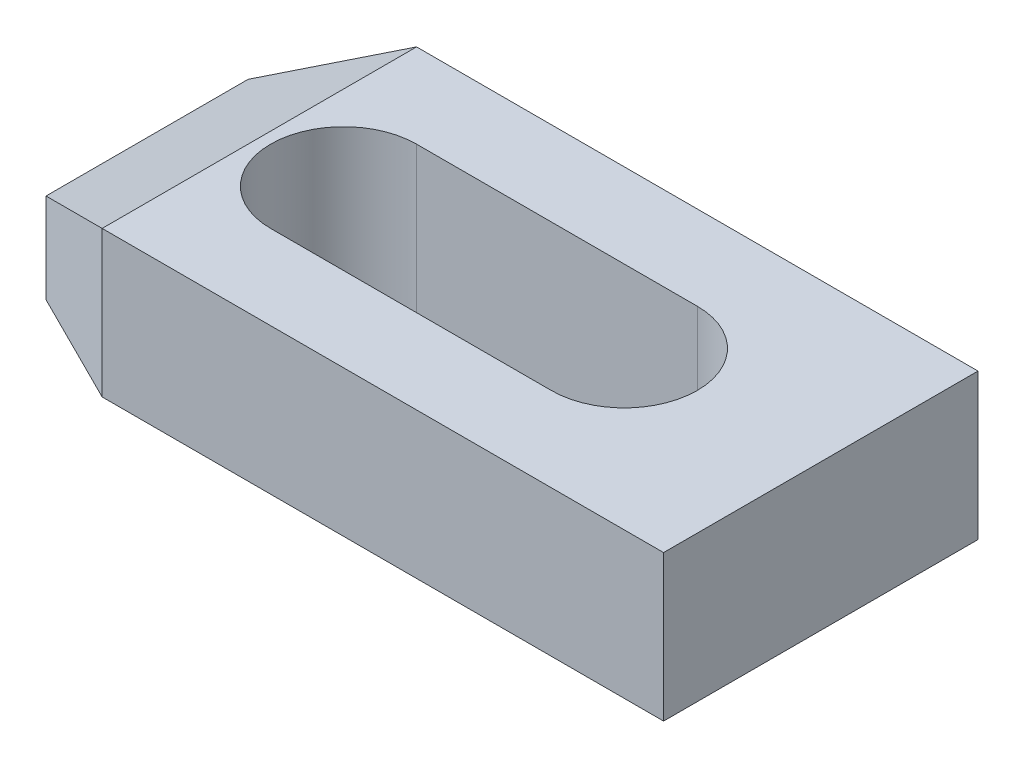
ISO-10303-21;
HEADER;
FILE_DESCRIPTION(('STEP AP214'),'2;1');
FILE_NAME('part.step','',(''),(''),'','','');
FILE_SCHEMA(('AUTOMOTIVE_DESIGN { 1 0 10303 214 1 1 1 1 }'));
ENDSEC;
DATA;
#1=APPLICATION_CONTEXT('core data for automotive mechanical design processes');
#2=APPLICATION_PROTOCOL_DEFINITION('international standard','automotive_design',2000,#1);
#3=PRODUCT_CONTEXT('',#1,'mechanical');
#4=PRODUCT('Part','Part','',(#3));
#5=PRODUCT_RELATED_PRODUCT_CATEGORY('part','',(#4));
#6=PRODUCT_DEFINITION_FORMATION('','',#4);
#7=PRODUCT_DEFINITION_CONTEXT('part definition',#1,'design');
#8=PRODUCT_DEFINITION('design','',#6,#7);
#9=PRODUCT_DEFINITION_SHAPE('','',#8);
#10=(LENGTH_UNIT() NAMED_UNIT(*) SI_UNIT(.MILLI.,.METRE.));
#11=(NAMED_UNIT(*) PLANE_ANGLE_UNIT() SI_UNIT($,.RADIAN.));
#12=(NAMED_UNIT(*) SI_UNIT($,.STERADIAN.) SOLID_ANGLE_UNIT());
#13=UNCERTAINTY_MEASURE_WITH_UNIT(LENGTH_MEASURE(1.E-05),#10,'distance_accuracy_value','');
#14=(GEOMETRIC_REPRESENTATION_CONTEXT(3) GLOBAL_UNCERTAINTY_ASSIGNED_CONTEXT((#13)) GLOBAL_UNIT_ASSIGNED_CONTEXT((#10,
#11,#12)) REPRESENTATION_CONTEXT('',''));
#15=CARTESIAN_POINT('',(0.,0.,0.));
#16=DIRECTION('',(0.,0.,1.));
#17=DIRECTION('',(1.,0.,0.));
#18=AXIS2_PLACEMENT_3D('',#15,#16,#17);
#19=CARTESIAN_POINT('',(0.,13.,0.));
#20=DIRECTION('',(0.,-1.,0.));
#21=DIRECTION('',(0.,0.,-1.));
#22=AXIS2_PLACEMENT_3D('',#19,#20,#21);
#23=PLANE('',#22);
#24=DIRECTION('',(-1.,0.,0.));
#25=VECTOR('',#24,1.);
#26=CARTESIAN_POINT('',(-20.,13.,-14.));
#27=LINE('',#26,#25);
#28=CARTESIAN_POINT('',(30.,13.,-14.));
#29=VERTEX_POINT('',#28);
#30=CARTESIAN_POINT('',(-20.,13.,-14.));
#31=VERTEX_POINT('',#30);
#32=EDGE_CURVE('E135',#29,#31,#27,.T.);
#33=ORIENTED_EDGE('',*,*,#32,.T.);
#34=DIRECTION('',(0.,0.,1.));
#35=VECTOR('',#34,1.);
#36=CARTESIAN_POINT('',(-20.,13.,-14.));
#37=LINE('',#36,#35);
#38=CARTESIAN_POINT('',(-20.,13.,14.));
#39=VERTEX_POINT('',#38);
#40=EDGE_CURVE('E115',#31,#39,#37,.T.);
#41=ORIENTED_EDGE('',*,*,#40,.T.);
#42=DIRECTION('',(1.,0.,0.));
#43=VECTOR('',#42,1.);
#44=CARTESIAN_POINT('',(-20.,13.,14.));
#45=LINE('',#44,#43);
#46=CARTESIAN_POINT('',(30.,13.,14.));
#47=VERTEX_POINT('',#46);
#48=EDGE_CURVE('E142',#39,#47,#45,.T.);
#49=ORIENTED_EDGE('',*,*,#48,.T.);
#50=DIRECTION('',(0.,0.,-1.));
#51=VECTOR('',#50,1.);
#52=CARTESIAN_POINT('',(30.,13.,14.));
#53=LINE('',#52,#51);
#54=EDGE_CURVE('E138',#47,#29,#53,.T.);
#55=ORIENTED_EDGE('',*,*,#54,.T.);
#56=EDGE_LOOP('',(#33,#41,#49,#55));
#57=FACE_BOUND('',#56,.T.);
#58=CARTESIAN_POINT('',(-12.5,13.,0.));
#59=DIRECTION('',(0.,1.,0.));
#60=DIRECTION('',(0.,0.,1.));
#61=AXIS2_PLACEMENT_3D('',#58,#59,#60);
#62=CIRCLE('',#61,6.5);
#63=CARTESIAN_POINT('',(-12.5,13.,-6.5));
#64=VERTEX_POINT('',#63);
#65=CARTESIAN_POINT('',(-12.5,13.,6.5));
#66=VERTEX_POINT('',#65);
#67=EDGE_CURVE('E185',#64,#66,#62,.T.);
#68=ORIENTED_EDGE('',*,*,#67,.F.);
#69=DIRECTION('',(-1.,0.,0.));
#70=VECTOR('',#69,1.);
#71=CARTESIAN_POINT('',(-12.5,13.,-6.5));
#72=LINE('',#71,#70);
#73=CARTESIAN_POINT('',(12.5,13.,-6.5));
#74=VERTEX_POINT('',#73);
#75=EDGE_CURVE('E181',#74,#64,#72,.T.);
#76=ORIENTED_EDGE('',*,*,#75,.F.);
#77=CARTESIAN_POINT('',(12.5,13.,0.));
#78=DIRECTION('',(0.,1.,0.));
#79=DIRECTION('',(0.,0.,1.));
#80=AXIS2_PLACEMENT_3D('',#77,#78,#79);
#81=CIRCLE('',#80,6.5);
#82=CARTESIAN_POINT('',(12.5,13.,6.49999999999999));
#83=VERTEX_POINT('',#82);
#84=EDGE_CURVE('E195',#83,#74,#81,.T.);
#85=ORIENTED_EDGE('',*,*,#84,.F.);
#86=DIRECTION('',(1.,0.,0.));
#87=VECTOR('',#86,1.);
#88=CARTESIAN_POINT('',(-12.5,13.,6.5));
#89=LINE('',#88,#87);
#90=EDGE_CURVE('E197',#66,#83,#89,.T.);
#91=ORIENTED_EDGE('',*,*,#90,.F.);
#92=EDGE_LOOP('',(#68,#76,#85,#91));
#93=FACE_BOUND('',#92,.T.);
#94=ADVANCED_FACE('F41',(#57,#93),#23,.F.);
#95=CARTESIAN_POINT('',(0.,0.,0.));
#96=DIRECTION('',(0.,-1.,0.));
#97=DIRECTION('',(0.,0.,-1.));
#98=AXIS2_PLACEMENT_3D('',#95,#96,#97);
#99=PLANE('',#98);
#100=DIRECTION('',(0.,0.,-1.));
#101=VECTOR('',#100,1.);
#102=CARTESIAN_POINT('',(30.,0.,14.));
#103=LINE('',#102,#101);
#104=CARTESIAN_POINT('',(30.,0.,14.));
#105=VERTEX_POINT('',#104);
#106=CARTESIAN_POINT('',(30.,0.,-14.));
#107=VERTEX_POINT('',#106);
#108=EDGE_CURVE('E167',#105,#107,#103,.T.);
#109=ORIENTED_EDGE('',*,*,#108,.F.);
#110=DIRECTION('',(1.,0.,0.));
#111=VECTOR('',#110,1.);
#112=CARTESIAN_POINT('',(-20.,0.,14.));
#113=LINE('',#112,#111);
#114=CARTESIAN_POINT('',(-20.,0.,14.));
#115=VERTEX_POINT('',#114);
#116=EDGE_CURVE('E157',#115,#105,#113,.T.);
#117=ORIENTED_EDGE('',*,*,#116,.F.);
#118=DIRECTION('',(0.894427190999916,0.,0.447213595499958));
#119=VECTOR('',#118,1.);
#120=CARTESIAN_POINT('',(-20.,0.,14.));
#121=LINE('',#120,#119);
#122=CARTESIAN_POINT('',(-30.,0.,9.));
#123=VERTEX_POINT('',#122);
#124=EDGE_CURVE('E159',#123,#115,#121,.T.);
#125=ORIENTED_EDGE('',*,*,#124,.F.);
#126=DIRECTION('',(0.,0.,1.));
#127=VECTOR('',#126,1.);
#128=CARTESIAN_POINT('',(-30.,0.,9.));
#129=LINE('',#128,#127);
#130=CARTESIAN_POINT('',(-30.,0.,-9.));
#131=VERTEX_POINT('',#130);
#132=EDGE_CURVE('E161',#131,#123,#129,.T.);
#133=ORIENTED_EDGE('',*,*,#132,.F.);
#134=DIRECTION('',(-0.894427190999916,0.,0.447213595499958));
#135=VECTOR('',#134,1.);
#136=CARTESIAN_POINT('',(-20.,0.,-14.));
#137=LINE('',#136,#135);
#138=CARTESIAN_POINT('',(-20.,0.,-14.));
#139=VERTEX_POINT('',#138);
#140=EDGE_CURVE('E164',#139,#131,#137,.T.);
#141=ORIENTED_EDGE('',*,*,#140,.F.);
#142=DIRECTION('',(-1.,0.,0.));
#143=VECTOR('',#142,1.);
#144=CARTESIAN_POINT('',(-20.,0.,-14.));
#145=LINE('',#144,#143);
#146=EDGE_CURVE('E145',#107,#139,#145,.T.);
#147=ORIENTED_EDGE('',*,*,#146,.F.);
#148=EDGE_LOOP('',(#109,#117,#125,#133,#141,#147));
#149=FACE_BOUND('',#148,.T.);
#150=DIRECTION('',(-1.,0.,0.));
#151=VECTOR('',#150,1.);
#152=CARTESIAN_POINT('',(-12.5,0.,-6.5));
#153=LINE('',#152,#151);
#154=CARTESIAN_POINT('',(12.5,0.,-6.5));
#155=VERTEX_POINT('',#154);
#156=CARTESIAN_POINT('',(-12.5,0.,-6.5));
#157=VERTEX_POINT('',#156);
#158=EDGE_CURVE('E182',#155,#157,#153,.T.);
#159=ORIENTED_EDGE('',*,*,#158,.T.);
#160=CARTESIAN_POINT('',(-12.5,0.,0.));
#161=DIRECTION('',(0.,1.,0.));
#162=DIRECTION('',(0.,0.,1.));
#163=AXIS2_PLACEMENT_3D('',#160,#161,#162);
#164=CIRCLE('',#163,6.5);
#165=CARTESIAN_POINT('',(-12.5,0.,6.5));
#166=VERTEX_POINT('',#165);
#167=EDGE_CURVE('E132',#157,#166,#164,.T.);
#168=ORIENTED_EDGE('',*,*,#167,.T.);
#169=DIRECTION('',(1.,0.,0.));
#170=VECTOR('',#169,1.);
#171=CARTESIAN_POINT('',(-12.5,0.,6.5));
#172=LINE('',#171,#170);
#173=CARTESIAN_POINT('',(12.5,0.,6.49999999999999));
#174=VERTEX_POINT('',#173);
#175=EDGE_CURVE('E189',#166,#174,#172,.T.);
#176=ORIENTED_EDGE('',*,*,#175,.T.);
#177=CARTESIAN_POINT('',(12.5,0.,0.));
#178=DIRECTION('',(0.,1.,0.));
#179=DIRECTION('',(0.,0.,1.));
#180=AXIS2_PLACEMENT_3D('',#177,#178,#179);
#181=CIRCLE('',#180,6.5);
#182=EDGE_CURVE('E186',#174,#155,#181,.T.);
#183=ORIENTED_EDGE('',*,*,#182,.T.);
#184=EDGE_LOOP('',(#159,#168,#176,#183));
#185=FACE_BOUND('',#184,.T.);
#186=ADVANCED_FACE('F215',(#149,#185),#99,.T.);
#187=CARTESIAN_POINT('',(30.,13.,14.));
#188=DIRECTION('',(-1.,0.,0.));
#189=DIRECTION('',(0.,0.,1.));
#190=AXIS2_PLACEMENT_3D('',#187,#188,#189);
#191=PLANE('',#190);
#192=ORIENTED_EDGE('',*,*,#108,.T.);
#193=DIRECTION('',(0.,-1.,0.));
#194=VECTOR('',#193,1.);
#195=CARTESIAN_POINT('',(30.,13.,-14.));
#196=LINE('',#195,#194);
#197=EDGE_CURVE('E49',#29,#107,#196,.T.);
#198=ORIENTED_EDGE('',*,*,#197,.F.);
#199=ORIENTED_EDGE('',*,*,#54,.F.);
#200=DIRECTION('',(0.,-1.,0.));
#201=VECTOR('',#200,1.);
#202=CARTESIAN_POINT('',(30.,13.,14.));
#203=LINE('',#202,#201);
#204=EDGE_CURVE('E154',#47,#105,#203,.T.);
#205=ORIENTED_EDGE('',*,*,#204,.T.);
#206=EDGE_LOOP('',(#192,#198,#199,#205));
#207=FACE_BOUND('',#206,.T.);
#208=ADVANCED_FACE('F43',(#207),#191,.F.);
#209=CARTESIAN_POINT('',(-20.,13.,-14.));
#210=DIRECTION('',(0.,0.,1.));
#211=DIRECTION('',(1.,0.,0.));
#212=AXIS2_PLACEMENT_3D('',#209,#210,#211);
#213=PLANE('',#212);
#214=ORIENTED_EDGE('',*,*,#146,.T.);
#215=DIRECTION('',(0.,-1.,0.));
#216=VECTOR('',#215,1.);
#217=CARTESIAN_POINT('',(-20.,13.,-14.));
#218=LINE('',#217,#216);
#219=EDGE_CURVE('E129',#31,#139,#218,.T.);
#220=ORIENTED_EDGE('',*,*,#219,.F.);
#221=ORIENTED_EDGE('',*,*,#32,.F.);
#222=ORIENTED_EDGE('',*,*,#197,.T.);
#223=EDGE_LOOP('',(#214,#220,#221,#222));
#224=FACE_BOUND('',#223,.T.);
#225=ADVANCED_FACE('F144',(#224),#213,.F.);
#226=CARTESIAN_POINT('',(-20.,13.,-14.));
#227=DIRECTION('',(0.447213595499958,0.,0.894427190999916));
#228=DIRECTION('',(0.894427190999916,0.,-0.447213595499958));
#229=AXIS2_PLACEMENT_3D('',#226,#227,#228);
#230=PLANE('',#229);
#231=DIRECTION('',(0.,-1.,0.));
#232=VECTOR('',#231,1.);
#233=CARTESIAN_POINT('',(-30.,13.,-9.));
#234=LINE('',#233,#232);
#235=CARTESIAN_POINT('',(-30.,8.,-9.));
#236=VERTEX_POINT('',#235);
#237=EDGE_CURVE('E131',#236,#131,#234,.T.);
#238=ORIENTED_EDGE('',*,*,#237,.F.);
#239=DIRECTION('',(0.816496580927726,0.408248290463863,-0.408248290463863));
#240=VECTOR('',#239,1.);
#241=CARTESIAN_POINT('',(-20.,13.,-14.));
#242=LINE('',#241,#240);
#243=EDGE_CURVE('E118',#236,#31,#242,.T.);
#244=ORIENTED_EDGE('',*,*,#243,.T.);
#245=ORIENTED_EDGE('',*,*,#219,.T.);
#246=ORIENTED_EDGE('',*,*,#140,.T.);
#247=EDGE_LOOP('',(#238,#244,#245,#246));
#248=FACE_BOUND('',#247,.T.);
#249=ADVANCED_FACE('F126',(#248),#230,.F.);
#250=CARTESIAN_POINT('',(-30.,13.,9.));
#251=DIRECTION('',(1.,0.,0.));
#252=DIRECTION('',(0.,0.,-1.));
#253=AXIS2_PLACEMENT_3D('',#250,#251,#252);
#254=PLANE('',#253);
#255=DIRECTION('',(0.,-1.,0.));
#256=VECTOR('',#255,1.);
#257=CARTESIAN_POINT('',(-30.,13.,9.));
#258=LINE('',#257,#256);
#259=CARTESIAN_POINT('',(-30.,8.,9.));
#260=VERTEX_POINT('',#259);
#261=EDGE_CURVE('E147',#260,#123,#258,.T.);
#262=ORIENTED_EDGE('',*,*,#261,.F.);
#263=DIRECTION('',(0.,0.,1.));
#264=VECTOR('',#263,1.);
#265=CARTESIAN_POINT('',(-30.,8.,-14.));
#266=LINE('',#265,#264);
#267=EDGE_CURVE('E56',#236,#260,#266,.T.);
#268=ORIENTED_EDGE('',*,*,#267,.F.);
#269=ORIENTED_EDGE('',*,*,#237,.T.);
#270=ORIENTED_EDGE('',*,*,#132,.T.);
#271=EDGE_LOOP('',(#262,#268,#269,#270));
#272=FACE_BOUND('',#271,.T.);
#273=ADVANCED_FACE('F243',(#272),#254,.F.);
#274=CARTESIAN_POINT('',(-20.,13.,14.));
#275=DIRECTION('',(0.447213595499958,0.,-0.894427190999916));
#276=DIRECTION('',(-0.894427190999916,0.,-0.447213595499958));
#277=AXIS2_PLACEMENT_3D('',#274,#275,#276);
#278=PLANE('',#277);
#279=DIRECTION('',(0.,-1.,0.));
#280=VECTOR('',#279,1.);
#281=CARTESIAN_POINT('',(-20.,13.,14.));
#282=LINE('',#281,#280);
#283=EDGE_CURVE('E151',#39,#115,#282,.T.);
#284=ORIENTED_EDGE('',*,*,#283,.F.);
#285=DIRECTION('',(-0.816496580927726,-0.408248290463863,-0.408248290463863));
#286=VECTOR('',#285,1.);
#287=CARTESIAN_POINT('',(-20.,13.,14.));
#288=LINE('',#287,#286);
#289=EDGE_CURVE('E12',#39,#260,#288,.T.);
#290=ORIENTED_EDGE('',*,*,#289,.T.);
#291=ORIENTED_EDGE('',*,*,#261,.T.);
#292=ORIENTED_EDGE('',*,*,#124,.T.);
#293=EDGE_LOOP('',(#284,#290,#291,#292));
#294=FACE_BOUND('',#293,.T.);
#295=ADVANCED_FACE('F239',(#294),#278,.F.);
#296=CARTESIAN_POINT('',(-20.,13.,14.));
#297=DIRECTION('',(0.,0.,-1.));
#298=DIRECTION('',(-1.,0.,0.));
#299=AXIS2_PLACEMENT_3D('',#296,#297,#298);
#300=PLANE('',#299);
#301=ORIENTED_EDGE('',*,*,#116,.T.);
#302=ORIENTED_EDGE('',*,*,#204,.F.);
#303=ORIENTED_EDGE('',*,*,#48,.F.);
#304=ORIENTED_EDGE('',*,*,#283,.T.);
#305=EDGE_LOOP('',(#301,#302,#303,#304));
#306=FACE_BOUND('',#305,.T.);
#307=ADVANCED_FACE('F236',(#306),#300,.F.);
#308=CARTESIAN_POINT('',(-12.5,13.,0.));
#309=DIRECTION('',(0.,-1.,0.));
#310=DIRECTION('',(0.,0.,-1.));
#311=AXIS2_PLACEMENT_3D('',#308,#309,#310);
#312=CYLINDRICAL_SURFACE('',#311,6.5);
#313=ORIENTED_EDGE('',*,*,#167,.F.);
#314=DIRECTION('',(0.,-1.,0.));
#315=VECTOR('',#314,1.);
#316=CARTESIAN_POINT('',(-12.5,13.,-6.5));
#317=LINE('',#316,#315);
#318=EDGE_CURVE('E178',#64,#157,#317,.T.);
#319=ORIENTED_EDGE('',*,*,#318,.F.);
#320=ORIENTED_EDGE('',*,*,#67,.T.);
#321=DIRECTION('',(0.,-1.,0.));
#322=VECTOR('',#321,1.);
#323=CARTESIAN_POINT('',(-12.5,13.,6.5));
#324=LINE('',#323,#322);
#325=EDGE_CURVE('E170',#66,#166,#324,.T.);
#326=ORIENTED_EDGE('',*,*,#325,.T.);
#327=EDGE_LOOP('',(#313,#319,#320,#326));
#328=FACE_BOUND('',#327,.T.);
#329=ADVANCED_FACE('F204',(#328),#312,.F.);
#330=CARTESIAN_POINT('',(-12.5,13.,6.5));
#331=DIRECTION('',(0.,0.,-1.));
#332=DIRECTION('',(-1.,0.,0.));
#333=AXIS2_PLACEMENT_3D('',#330,#331,#332);
#334=PLANE('',#333);
#335=ORIENTED_EDGE('',*,*,#175,.F.);
#336=ORIENTED_EDGE('',*,*,#325,.F.);
#337=ORIENTED_EDGE('',*,*,#90,.T.);
#338=DIRECTION('',(0.,-1.,0.));
#339=VECTOR('',#338,1.);
#340=CARTESIAN_POINT('',(12.5,13.,6.49999999999999));
#341=LINE('',#340,#339);
#342=EDGE_CURVE('E175',#83,#174,#341,.T.);
#343=ORIENTED_EDGE('',*,*,#342,.T.);
#344=EDGE_LOOP('',(#335,#336,#337,#343));
#345=FACE_BOUND('',#344,.T.);
#346=ADVANCED_FACE('F208',(#345),#334,.T.);
#347=CARTESIAN_POINT('',(12.5,13.,0.));
#348=DIRECTION('',(0.,-1.,0.));
#349=DIRECTION('',(0.,0.,-1.));
#350=AXIS2_PLACEMENT_3D('',#347,#348,#349);
#351=CYLINDRICAL_SURFACE('',#350,6.5);
#352=ORIENTED_EDGE('',*,*,#182,.F.);
#353=ORIENTED_EDGE('',*,*,#342,.F.);
#354=ORIENTED_EDGE('',*,*,#84,.T.);
#355=DIRECTION('',(0.,-1.,0.));
#356=VECTOR('',#355,1.);
#357=CARTESIAN_POINT('',(12.5,13.,-6.5));
#358=LINE('',#357,#356);
#359=EDGE_CURVE('E63',#74,#155,#358,.T.);
#360=ORIENTED_EDGE('',*,*,#359,.T.);
#361=EDGE_LOOP('',(#352,#353,#354,#360));
#362=FACE_BOUND('',#361,.T.);
#363=ADVANCED_FACE('F213',(#362),#351,.F.);
#364=CARTESIAN_POINT('',(-12.5,13.,-6.5));
#365=DIRECTION('',(0.,0.,1.));
#366=DIRECTION('',(1.,0.,0.));
#367=AXIS2_PLACEMENT_3D('',#364,#365,#366);
#368=PLANE('',#367);
#369=ORIENTED_EDGE('',*,*,#158,.F.);
#370=ORIENTED_EDGE('',*,*,#359,.F.);
#371=ORIENTED_EDGE('',*,*,#75,.T.);
#372=ORIENTED_EDGE('',*,*,#318,.T.);
#373=EDGE_LOOP('',(#369,#370,#371,#372));
#374=FACE_BOUND('',#373,.T.);
#375=ADVANCED_FACE('F216',(#374),#368,.T.);
#376=CARTESIAN_POINT('',(-20.,13.,-14.));
#377=DIRECTION('',(0.447213595499958,-0.894427190999916,0.));
#378=DIRECTION('',(0.894427190999916,0.447213595499958,0.));
#379=AXIS2_PLACEMENT_3D('',#376,#377,#378);
#380=PLANE('',#379);
#381=ORIENTED_EDGE('',*,*,#267,.T.);
#382=ORIENTED_EDGE('',*,*,#289,.F.);
#383=ORIENTED_EDGE('',*,*,#40,.F.);
#384=ORIENTED_EDGE('',*,*,#243,.F.);
#385=EDGE_LOOP('',(#381,#382,#383,#384));
#386=FACE_BOUND('',#385,.T.);
#387=ADVANCED_FACE('F117',(#386),#380,.F.);
#388=CLOSED_SHELL('',(#94,#186,#208,#225,#249,#273,#295,#307,#329,#346,#363,#375,#387));
#389=MANIFOLD_SOLID_BREP('B2',#388);
#390=ADVANCED_BREP_SHAPE_REPRESENTATION('',(#18,#389),#14);
#391=SHAPE_DEFINITION_REPRESENTATION(#9,#390);
ENDSEC;
END-ISO-10303-21;
